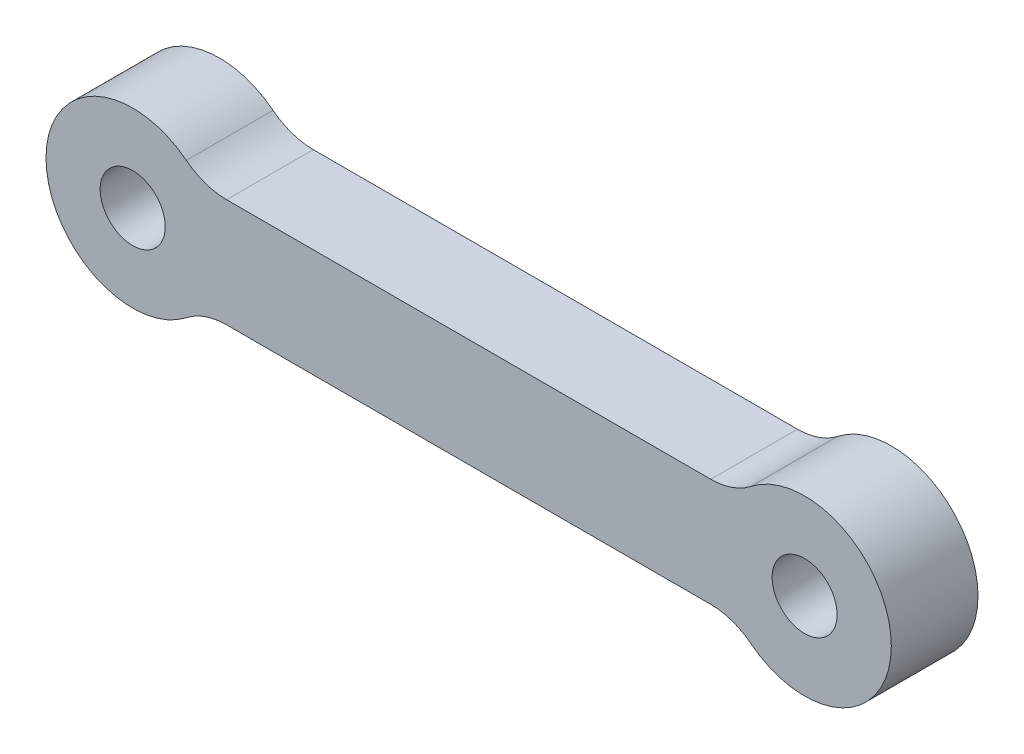
ISO-10303-21;
HEADER;
FILE_DESCRIPTION(('STEP AP214'),'2;1');
FILE_NAME('part.step','',(''),(''),'','','');
FILE_SCHEMA(('AUTOMOTIVE_DESIGN { 1 0 10303 214 1 1 1 1 }'));
ENDSEC;
DATA;
#1=APPLICATION_CONTEXT('core data for automotive mechanical design processes');
#2=APPLICATION_PROTOCOL_DEFINITION('international standard','automotive_design',2000,#1);
#3=PRODUCT_CONTEXT('',#1,'mechanical');
#4=PRODUCT('Part','Part','',(#3));
#5=PRODUCT_RELATED_PRODUCT_CATEGORY('part','',(#4));
#6=PRODUCT_DEFINITION_FORMATION('','',#4);
#7=PRODUCT_DEFINITION_CONTEXT('part definition',#1,'design');
#8=PRODUCT_DEFINITION('design','',#6,#7);
#9=PRODUCT_DEFINITION_SHAPE('','',#8);
#10=(LENGTH_UNIT() NAMED_UNIT(*) SI_UNIT(.MILLI.,.METRE.));
#11=(NAMED_UNIT(*) PLANE_ANGLE_UNIT() SI_UNIT($,.RADIAN.));
#12=(NAMED_UNIT(*) SI_UNIT($,.STERADIAN.) SOLID_ANGLE_UNIT());
#13=UNCERTAINTY_MEASURE_WITH_UNIT(LENGTH_MEASURE(1.E-05),#10,'distance_accuracy_value','');
#14=(GEOMETRIC_REPRESENTATION_CONTEXT(3) GLOBAL_UNCERTAINTY_ASSIGNED_CONTEXT((#13)) GLOBAL_UNIT_ASSIGNED_CONTEXT((#10,
#11,#12)) REPRESENTATION_CONTEXT('',''));
#15=CARTESIAN_POINT('',(0.,0.,0.));
#16=DIRECTION('',(0.,0.,1.));
#17=DIRECTION('',(1.,0.,0.));
#18=AXIS2_PLACEMENT_3D('',#15,#16,#17);
#19=CARTESIAN_POINT('',(11.1698729810778,-5.5,4.));
#20=DIRECTION('',(0.,0.,-1.));
#21=DIRECTION('',(-1.,0.,0.));
#22=AXIS2_PLACEMENT_3D('',#19,#20,#21);
#23=PLANE('',#22);
#24=CARTESIAN_POINT('',(11.1698729810778,-5.5,4.));
#25=DIRECTION('',(0.,0.,-1.));
#26=DIRECTION('',(-1.,0.,0.));
#27=AXIS2_PLACEMENT_3D('',#24,#25,#26);
#28=CIRCLE('',#27,3.);
#29=CARTESIAN_POINT('',(11.1698729810778,-2.5,4.));
#30=VERTEX_POINT('',#29);
#31=CARTESIAN_POINT('',(13.025641703473,-3.14285714285714,4.));
#32=VERTEX_POINT('',#31);
#33=EDGE_CURVE('E167',#30,#32,#28,.T.);
#34=ORIENTED_EDGE('',*,*,#33,.T.);
#35=CARTESIAN_POINT('',(15.5,0.,4.));
#36=DIRECTION('',(0.,0.,1.));
#37=DIRECTION('',(-1.,0.,0.));
#38=AXIS2_PLACEMENT_3D('',#35,#36,#37);
#39=CIRCLE('',#38,4.);
#40=CARTESIAN_POINT('',(13.025641703473,3.14285714285714,4.));
#41=VERTEX_POINT('',#40);
#42=EDGE_CURVE('E103',#32,#41,#39,.T.);
#43=ORIENTED_EDGE('',*,*,#42,.T.);
#44=CARTESIAN_POINT('',(11.1698729810778,5.5,4.));
#45=DIRECTION('',(0.,0.,-1.));
#46=DIRECTION('',(1.,0.,0.));
#47=AXIS2_PLACEMENT_3D('',#44,#45,#46);
#48=CIRCLE('',#47,3.);
#49=CARTESIAN_POINT('',(11.1698729810778,2.5,4.));
#50=VERTEX_POINT('',#49);
#51=EDGE_CURVE('E188',#41,#50,#48,.T.);
#52=ORIENTED_EDGE('',*,*,#51,.T.);
#53=DIRECTION('',(-1.,0.,0.));
#54=VECTOR('',#53,1.);
#55=CARTESIAN_POINT('',(-11.1698729810778,2.5,4.));
#56=LINE('',#55,#54);
#57=CARTESIAN_POINT('',(-11.1698729810778,2.5,4.));
#58=VERTEX_POINT('',#57);
#59=EDGE_CURVE('E202',#50,#58,#56,.T.);
#60=ORIENTED_EDGE('',*,*,#59,.T.);
#61=CARTESIAN_POINT('',(-11.1698729810778,5.5,4.));
#62=DIRECTION('',(0.,0.,-1.));
#63=DIRECTION('',(1.,0.,0.));
#64=AXIS2_PLACEMENT_3D('',#61,#62,#63);
#65=CIRCLE('',#64,3.);
#66=CARTESIAN_POINT('',(-13.025641703473,3.14285714285714,4.));
#67=VERTEX_POINT('',#66);
#68=EDGE_CURVE('E122',#58,#67,#65,.T.);
#69=ORIENTED_EDGE('',*,*,#68,.T.);
#70=CARTESIAN_POINT('',(-15.5,0.,4.));
#71=DIRECTION('',(0.,0.,1.));
#72=DIRECTION('',(1.,0.,0.));
#73=AXIS2_PLACEMENT_3D('',#70,#71,#72);
#74=CIRCLE('',#73,4.);
#75=CARTESIAN_POINT('',(-13.025641703473,-3.14285714285714,4.));
#76=VERTEX_POINT('',#75);
#77=EDGE_CURVE('E116',#67,#76,#74,.T.);
#78=ORIENTED_EDGE('',*,*,#77,.T.);
#79=CARTESIAN_POINT('',(-11.1698729810778,-5.5,4.));
#80=DIRECTION('',(0.,0.,-1.));
#81=DIRECTION('',(1.,0.,0.));
#82=AXIS2_PLACEMENT_3D('',#79,#80,#81);
#83=CIRCLE('',#82,3.);
#84=CARTESIAN_POINT('',(-11.1698729810778,-2.5,4.));
#85=VERTEX_POINT('',#84);
#86=EDGE_CURVE('E120',#76,#85,#83,.T.);
#87=ORIENTED_EDGE('',*,*,#86,.T.);
#88=DIRECTION('',(1.,0.,0.));
#89=VECTOR('',#88,1.);
#90=CARTESIAN_POINT('',(-11.1698729810778,-2.5,4.));
#91=LINE('',#90,#89);
#92=EDGE_CURVE('E60',#85,#30,#91,.T.);
#93=ORIENTED_EDGE('',*,*,#92,.T.);
#94=EDGE_LOOP('',(#34,#43,#52,#60,#69,#78,#87,#93));
#95=FACE_BOUND('',#94,.T.);
#96=CARTESIAN_POINT('',(-15.5,0.,4.));
#97=DIRECTION('',(0.,0.,1.));
#98=DIRECTION('',(1.,0.,0.));
#99=AXIS2_PLACEMENT_3D('',#96,#97,#98);
#100=CIRCLE('',#99,1.5);
#101=CARTESIAN_POINT('',(-14.,0.,4.));
#102=VERTEX_POINT('',#101);
#103=EDGE_CURVE('E149',#102,#102,#100,.T.);
#104=ORIENTED_EDGE('',*,*,#103,.F.);
#105=EDGE_LOOP('',(#104));
#106=FACE_BOUND('',#105,.T.);
#107=CARTESIAN_POINT('',(15.5,0.,4.));
#108=DIRECTION('',(0.,0.,1.));
#109=DIRECTION('',(-1.,0.,0.));
#110=AXIS2_PLACEMENT_3D('',#107,#108,#109);
#111=CIRCLE('',#110,1.5);
#112=CARTESIAN_POINT('',(14.,0.,4.));
#113=VERTEX_POINT('',#112);
#114=EDGE_CURVE('E216',#113,#113,#111,.T.);
#115=ORIENTED_EDGE('',*,*,#114,.F.);
#116=EDGE_LOOP('',(#115));
#117=FACE_BOUND('',#116,.T.);
#118=ADVANCED_FACE('F42',(#95,#106,#117),#23,.F.);
#119=CARTESIAN_POINT('',(11.1698729810778,-5.5,0.));
#120=DIRECTION('',(0.,0.,-1.));
#121=DIRECTION('',(-1.,0.,0.));
#122=AXIS2_PLACEMENT_3D('',#119,#120,#121);
#123=PLANE('',#122);
#124=CARTESIAN_POINT('',(-15.5,0.,0.));
#125=DIRECTION('',(0.,0.,1.));
#126=DIRECTION('',(1.,0.,0.));
#127=AXIS2_PLACEMENT_3D('',#124,#125,#126);
#128=CIRCLE('',#127,1.5);
#129=CARTESIAN_POINT('',(-14.,0.,0.));
#130=VERTEX_POINT('',#129);
#131=EDGE_CURVE('E212',#130,#130,#128,.T.);
#132=ORIENTED_EDGE('',*,*,#131,.T.);
#133=EDGE_LOOP('',(#132));
#134=FACE_BOUND('',#133,.T.);
#135=CARTESIAN_POINT('',(11.1698729810778,-5.5,0.));
#136=DIRECTION('',(0.,0.,-1.));
#137=DIRECTION('',(-1.,0.,0.));
#138=AXIS2_PLACEMENT_3D('',#135,#136,#137);
#139=CIRCLE('',#138,3.);
#140=CARTESIAN_POINT('',(11.1698729810778,-2.5,0.));
#141=VERTEX_POINT('',#140);
#142=CARTESIAN_POINT('',(13.025641703473,-3.14285714285714,0.));
#143=VERTEX_POINT('',#142);
#144=EDGE_CURVE('E144',#141,#143,#139,.T.);
#145=ORIENTED_EDGE('',*,*,#144,.F.);
#146=DIRECTION('',(1.,0.,0.));
#147=VECTOR('',#146,1.);
#148=CARTESIAN_POINT('',(-11.1698729810778,-2.5,0.));
#149=LINE('',#148,#147);
#150=CARTESIAN_POINT('',(-11.1698729810778,-2.5,0.));
#151=VERTEX_POINT('',#150);
#152=EDGE_CURVE('E95',#151,#141,#149,.T.);
#153=ORIENTED_EDGE('',*,*,#152,.F.);
#154=CARTESIAN_POINT('',(-11.1698729810778,-5.5,0.));
#155=DIRECTION('',(0.,0.,-1.));
#156=DIRECTION('',(1.,0.,0.));
#157=AXIS2_PLACEMENT_3D('',#154,#155,#156);
#158=CIRCLE('',#157,3.);
#159=CARTESIAN_POINT('',(-13.025641703473,-3.14285714285714,0.));
#160=VERTEX_POINT('',#159);
#161=EDGE_CURVE('E89',#160,#151,#158,.T.);
#162=ORIENTED_EDGE('',*,*,#161,.F.);
#163=CARTESIAN_POINT('',(-15.5,0.,0.));
#164=DIRECTION('',(0.,0.,1.));
#165=DIRECTION('',(1.,0.,0.));
#166=AXIS2_PLACEMENT_3D('',#163,#164,#165);
#167=CIRCLE('',#166,4.);
#168=CARTESIAN_POINT('',(-13.025641703473,3.14285714285714,0.));
#169=VERTEX_POINT('',#168);
#170=EDGE_CURVE('E131',#169,#160,#167,.T.);
#171=ORIENTED_EDGE('',*,*,#170,.F.);
#172=CARTESIAN_POINT('',(-11.1698729810778,5.5,0.));
#173=DIRECTION('',(0.,0.,-1.));
#174=DIRECTION('',(1.,0.,0.));
#175=AXIS2_PLACEMENT_3D('',#172,#173,#174);
#176=CIRCLE('',#175,3.);
#177=CARTESIAN_POINT('',(-11.1698729810778,2.5,0.));
#178=VERTEX_POINT('',#177);
#179=EDGE_CURVE('E158',#178,#169,#176,.T.);
#180=ORIENTED_EDGE('',*,*,#179,.F.);
#181=DIRECTION('',(-1.,0.,0.));
#182=VECTOR('',#181,1.);
#183=CARTESIAN_POINT('',(-11.1698729810778,2.5,0.));
#184=LINE('',#183,#182);
#185=CARTESIAN_POINT('',(11.1698729810778,2.5,0.));
#186=VERTEX_POINT('',#185);
#187=EDGE_CURVE('E155',#186,#178,#184,.T.);
#188=ORIENTED_EDGE('',*,*,#187,.F.);
#189=CARTESIAN_POINT('',(11.1698729810778,5.5,0.));
#190=DIRECTION('',(0.,0.,-1.));
#191=DIRECTION('',(1.,0.,0.));
#192=AXIS2_PLACEMENT_3D('',#189,#190,#191);
#193=CIRCLE('',#192,3.);
#194=CARTESIAN_POINT('',(13.025641703473,3.14285714285714,0.));
#195=VERTEX_POINT('',#194);
#196=EDGE_CURVE('E152',#195,#186,#193,.T.);
#197=ORIENTED_EDGE('',*,*,#196,.F.);
#198=CARTESIAN_POINT('',(15.5,0.,0.));
#199=DIRECTION('',(0.,0.,1.));
#200=DIRECTION('',(-1.,0.,0.));
#201=AXIS2_PLACEMENT_3D('',#198,#199,#200);
#202=CIRCLE('',#201,4.);
#203=EDGE_CURVE('E148',#143,#195,#202,.T.);
#204=ORIENTED_EDGE('',*,*,#203,.F.);
#205=EDGE_LOOP('',(#145,#153,#162,#171,#180,#188,#197,#204));
#206=FACE_BOUND('',#205,.T.);
#207=CARTESIAN_POINT('',(15.5,0.,0.));
#208=DIRECTION('',(0.,0.,1.));
#209=DIRECTION('',(-1.,0.,0.));
#210=AXIS2_PLACEMENT_3D('',#207,#208,#209);
#211=CIRCLE('',#210,1.5);
#212=CARTESIAN_POINT('',(14.,0.,0.));
#213=VERTEX_POINT('',#212);
#214=EDGE_CURVE('E220',#213,#213,#211,.T.);
#215=ORIENTED_EDGE('',*,*,#214,.T.);
#216=EDGE_LOOP('',(#215));
#217=FACE_BOUND('',#216,.T.);
#218=ADVANCED_FACE('F192',(#134,#206,#217),#123,.T.);
#219=CARTESIAN_POINT('',(11.1698729810778,-5.5,4.));
#220=DIRECTION('',(0.,0.,-1.));
#221=DIRECTION('',(-1.,0.,0.));
#222=AXIS2_PLACEMENT_3D('',#219,#220,#221);
#223=CYLINDRICAL_SURFACE('',#222,3.);
#224=ORIENTED_EDGE('',*,*,#144,.T.);
#225=DIRECTION('',(0.,0.,-1.));
#226=VECTOR('',#225,1.);
#227=CARTESIAN_POINT('',(13.025641703473,-3.14285714285714,4.));
#228=LINE('',#227,#226);
#229=EDGE_CURVE('E11',#32,#143,#228,.T.);
#230=ORIENTED_EDGE('',*,*,#229,.F.);
#231=ORIENTED_EDGE('',*,*,#33,.F.);
#232=DIRECTION('',(0.,0.,-1.));
#233=VECTOR('',#232,1.);
#234=CARTESIAN_POINT('',(11.1698729810778,-2.5,4.));
#235=LINE('',#234,#233);
#236=EDGE_CURVE('E140',#30,#141,#235,.T.);
#237=ORIENTED_EDGE('',*,*,#236,.T.);
#238=EDGE_LOOP('',(#224,#230,#231,#237));
#239=FACE_BOUND('',#238,.T.);
#240=ADVANCED_FACE('F44',(#239),#223,.F.);
#241=CARTESIAN_POINT('',(15.5,0.,4.));
#242=DIRECTION('',(0.,0.,-1.));
#243=DIRECTION('',(-1.,0.,0.));
#244=AXIS2_PLACEMENT_3D('',#241,#242,#243);
#245=CYLINDRICAL_SURFACE('',#244,4.);
#246=ORIENTED_EDGE('',*,*,#203,.T.);
#247=DIRECTION('',(0.,0.,-1.));
#248=VECTOR('',#247,1.);
#249=CARTESIAN_POINT('',(13.025641703473,3.14285714285714,4.));
#250=LINE('',#249,#248);
#251=EDGE_CURVE('E52',#41,#195,#250,.T.);
#252=ORIENTED_EDGE('',*,*,#251,.F.);
#253=ORIENTED_EDGE('',*,*,#42,.F.);
#254=ORIENTED_EDGE('',*,*,#229,.T.);
#255=EDGE_LOOP('',(#246,#252,#253,#254));
#256=FACE_BOUND('',#255,.T.);
#257=ADVANCED_FACE('F254',(#256),#245,.T.);
#258=CARTESIAN_POINT('',(11.1698729810778,5.5,4.));
#259=DIRECTION('',(0.,0.,-1.));
#260=DIRECTION('',(-1.,0.,0.));
#261=AXIS2_PLACEMENT_3D('',#258,#259,#260);
#262=CYLINDRICAL_SURFACE('',#261,3.);
#263=ORIENTED_EDGE('',*,*,#196,.T.);
#264=DIRECTION('',(0.,0.,-1.));
#265=VECTOR('',#264,1.);
#266=CARTESIAN_POINT('',(11.1698729810778,2.5,4.));
#267=LINE('',#266,#265);
#268=EDGE_CURVE('E178',#50,#186,#267,.T.);
#269=ORIENTED_EDGE('',*,*,#268,.F.);
#270=ORIENTED_EDGE('',*,*,#51,.F.);
#271=ORIENTED_EDGE('',*,*,#251,.T.);
#272=EDGE_LOOP('',(#263,#269,#270,#271));
#273=FACE_BOUND('',#272,.T.);
#274=ADVANCED_FACE('F186',(#273),#262,.F.);
#275=CARTESIAN_POINT('',(-11.1698729810778,2.5,4.));
#276=DIRECTION('',(0.,-1.,0.));
#277=DIRECTION('',(0.,0.,-1.));
#278=AXIS2_PLACEMENT_3D('',#275,#276,#277);
#279=PLANE('',#278);
#280=ORIENTED_EDGE('',*,*,#187,.T.);
#281=DIRECTION('',(0.,0.,-1.));
#282=VECTOR('',#281,1.);
#283=CARTESIAN_POINT('',(-11.1698729810778,2.5,4.));
#284=LINE('',#283,#282);
#285=EDGE_CURVE('E174',#58,#178,#284,.T.);
#286=ORIENTED_EDGE('',*,*,#285,.F.);
#287=ORIENTED_EDGE('',*,*,#59,.F.);
#288=ORIENTED_EDGE('',*,*,#268,.T.);
#289=EDGE_LOOP('',(#280,#286,#287,#288));
#290=FACE_BOUND('',#289,.T.);
#291=ADVANCED_FACE('F197',(#290),#279,.F.);
#292=CARTESIAN_POINT('',(-11.1698729810778,5.5,4.));
#293=DIRECTION('',(0.,0.,-1.));
#294=DIRECTION('',(-1.,0.,0.));
#295=AXIS2_PLACEMENT_3D('',#292,#293,#294);
#296=CYLINDRICAL_SURFACE('',#295,3.);
#297=ORIENTED_EDGE('',*,*,#179,.T.);
#298=DIRECTION('',(0.,0.,-1.));
#299=VECTOR('',#298,1.);
#300=CARTESIAN_POINT('',(-13.025641703473,3.14285714285714,4.));
#301=LINE('',#300,#299);
#302=EDGE_CURVE('E133',#67,#169,#301,.T.);
#303=ORIENTED_EDGE('',*,*,#302,.F.);
#304=ORIENTED_EDGE('',*,*,#68,.F.);
#305=ORIENTED_EDGE('',*,*,#285,.T.);
#306=EDGE_LOOP('',(#297,#303,#304,#305));
#307=FACE_BOUND('',#306,.T.);
#308=ADVANCED_FACE('F200',(#307),#296,.F.);
#309=CARTESIAN_POINT('',(-15.5,0.,4.));
#310=DIRECTION('',(0.,0.,-1.));
#311=DIRECTION('',(-1.,0.,0.));
#312=AXIS2_PLACEMENT_3D('',#309,#310,#311);
#313=CYLINDRICAL_SURFACE('',#312,4.);
#314=ORIENTED_EDGE('',*,*,#170,.T.);
#315=DIRECTION('',(0.,0.,-1.));
#316=VECTOR('',#315,1.);
#317=CARTESIAN_POINT('',(-13.025641703473,-3.14285714285714,4.));
#318=LINE('',#317,#316);
#319=EDGE_CURVE('E128',#76,#160,#318,.T.);
#320=ORIENTED_EDGE('',*,*,#319,.F.);
#321=ORIENTED_EDGE('',*,*,#77,.F.);
#322=ORIENTED_EDGE('',*,*,#302,.T.);
#323=EDGE_LOOP('',(#314,#320,#321,#322));
#324=FACE_BOUND('',#323,.T.);
#325=ADVANCED_FACE('F129',(#324),#313,.T.);
#326=CARTESIAN_POINT('',(-11.1698729810778,-5.5,4.));
#327=DIRECTION('',(0.,0.,-1.));
#328=DIRECTION('',(-1.,0.,0.));
#329=AXIS2_PLACEMENT_3D('',#326,#327,#328);
#330=CYLINDRICAL_SURFACE('',#329,3.);
#331=ORIENTED_EDGE('',*,*,#161,.T.);
#332=DIRECTION('',(0.,0.,-1.));
#333=VECTOR('',#332,1.);
#334=CARTESIAN_POINT('',(-11.1698729810778,-2.5,4.));
#335=LINE('',#334,#333);
#336=EDGE_CURVE('E134',#85,#151,#335,.T.);
#337=ORIENTED_EDGE('',*,*,#336,.F.);
#338=ORIENTED_EDGE('',*,*,#86,.F.);
#339=ORIENTED_EDGE('',*,*,#319,.T.);
#340=EDGE_LOOP('',(#331,#337,#338,#339));
#341=FACE_BOUND('',#340,.T.);
#342=ADVANCED_FACE('F136',(#341),#330,.F.);
#343=CARTESIAN_POINT('',(-11.1698729810778,-2.5,4.));
#344=DIRECTION('',(0.,1.,0.));
#345=DIRECTION('',(-1.,0.,0.));
#346=AXIS2_PLACEMENT_3D('',#343,#344,#345);
#347=PLANE('',#346);
#348=ORIENTED_EDGE('',*,*,#152,.T.);
#349=ORIENTED_EDGE('',*,*,#236,.F.);
#350=ORIENTED_EDGE('',*,*,#92,.F.);
#351=ORIENTED_EDGE('',*,*,#336,.T.);
#352=EDGE_LOOP('',(#348,#349,#350,#351));
#353=FACE_BOUND('',#352,.T.);
#354=ADVANCED_FACE('F242',(#353),#347,.F.);
#355=CARTESIAN_POINT('',(-15.5,0.,4.));
#356=DIRECTION('',(0.,0.,-1.));
#357=DIRECTION('',(-1.,0.,0.));
#358=AXIS2_PLACEMENT_3D('',#355,#356,#357);
#359=CYLINDRICAL_SURFACE('',#358,1.5);
#360=ORIENTED_EDGE('',*,*,#103,.T.);
#361=EDGE_LOOP('',(#360));
#362=FACE_BOUND('',#361,.T.);
#363=ORIENTED_EDGE('',*,*,#131,.F.);
#364=EDGE_LOOP('',(#363));
#365=FACE_BOUND('',#364,.T.);
#366=ADVANCED_FACE('F239',(#362,#365),#359,.F.);
#367=CARTESIAN_POINT('',(15.5,0.,4.));
#368=DIRECTION('',(0.,0.,-1.));
#369=DIRECTION('',(-1.,0.,0.));
#370=AXIS2_PLACEMENT_3D('',#367,#368,#369);
#371=CYLINDRICAL_SURFACE('',#370,1.5);
#372=ORIENTED_EDGE('',*,*,#114,.T.);
#373=EDGE_LOOP('',(#372));
#374=FACE_BOUND('',#373,.T.);
#375=ORIENTED_EDGE('',*,*,#214,.F.);
#376=EDGE_LOOP('',(#375));
#377=FACE_BOUND('',#376,.T.);
#378=ADVANCED_FACE('F228',(#374,#377),#371,.F.);
#379=CLOSED_SHELL('',(#118,#218,#240,#257,#274,#291,#308,#325,#342,#354,#366,#378));
#380=MANIFOLD_SOLID_BREP('B2',#379);
#381=ADVANCED_BREP_SHAPE_REPRESENTATION('',(#18,#380),#14);
#382=SHAPE_DEFINITION_REPRESENTATION(#9,#381);
ENDSEC;
END-ISO-10303-21;
